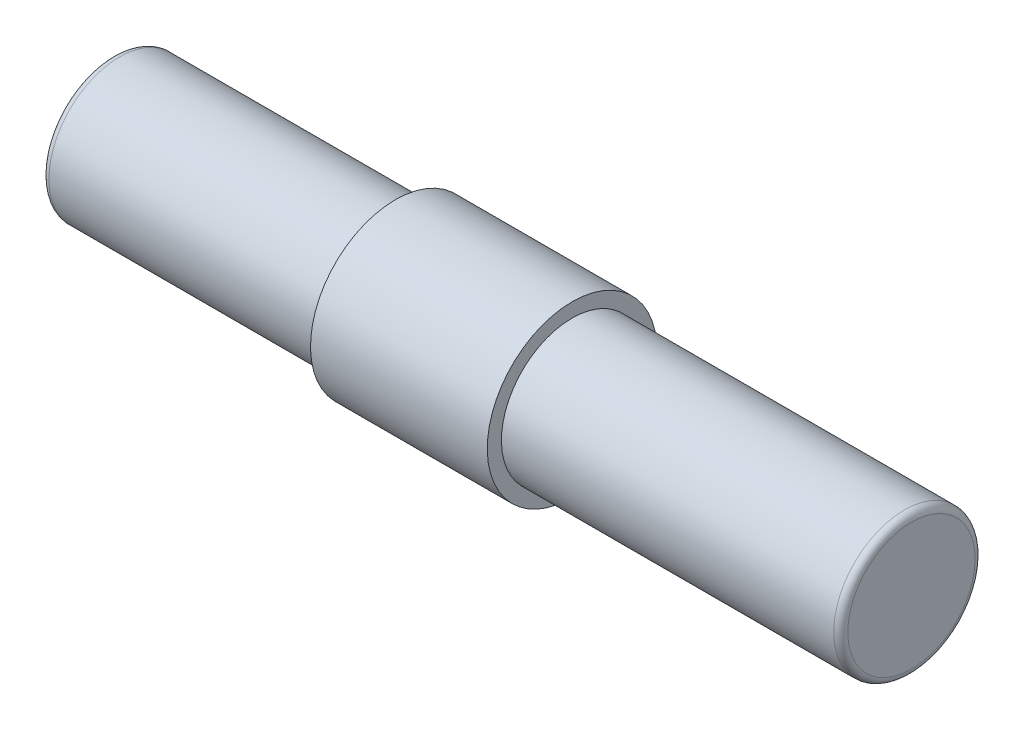
ISO-10303-21;
HEADER;
FILE_DESCRIPTION(('STEP AP214'),'2;1');
FILE_NAME('part.step','',(''),(''),'','','');
FILE_SCHEMA(('AUTOMOTIVE_DESIGN { 1 0 10303 214 1 1 1 1 }'));
ENDSEC;
DATA;
#1=APPLICATION_CONTEXT('core data for automotive mechanical design processes');
#2=APPLICATION_PROTOCOL_DEFINITION('international standard','automotive_design',2000,#1);
#3=PRODUCT_CONTEXT('',#1,'mechanical');
#4=PRODUCT('Part','Part','',(#3));
#5=PRODUCT_RELATED_PRODUCT_CATEGORY('part','',(#4));
#6=PRODUCT_DEFINITION_FORMATION('','',#4);
#7=PRODUCT_DEFINITION_CONTEXT('part definition',#1,'design');
#8=PRODUCT_DEFINITION('design','',#6,#7);
#9=PRODUCT_DEFINITION_SHAPE('','',#8);
#10=(LENGTH_UNIT() NAMED_UNIT(*) SI_UNIT(.MILLI.,.METRE.));
#11=(NAMED_UNIT(*) PLANE_ANGLE_UNIT() SI_UNIT($,.RADIAN.));
#12=(NAMED_UNIT(*) SI_UNIT($,.STERADIAN.) SOLID_ANGLE_UNIT());
#13=UNCERTAINTY_MEASURE_WITH_UNIT(LENGTH_MEASURE(1.E-05),#10,'distance_accuracy_value','');
#14=(GEOMETRIC_REPRESENTATION_CONTEXT(3) GLOBAL_UNCERTAINTY_ASSIGNED_CONTEXT((#13)) GLOBAL_UNIT_ASSIGNED_CONTEXT((#10,
#11,#12)) REPRESENTATION_CONTEXT('',''));
#15=CARTESIAN_POINT('',(0.,0.,0.));
#16=DIRECTION('',(0.,0.,1.));
#17=DIRECTION('',(1.,0.,0.));
#18=AXIS2_PLACEMENT_3D('',#15,#16,#17);
#19=CARTESIAN_POINT('',(-57.4683821152127,0.,0.));
#20=DIRECTION('',(-1.,0.,0.));
#21=DIRECTION('',(0.,-1.,0.));
#22=AXIS2_PLACEMENT_3D('',#19,#20,#21);
#23=PLANE('',#22);
#24=CARTESIAN_POINT('',(-57.4683821152127,0.,0.));
#25=DIRECTION('',(-1.,0.,0.));
#26=DIRECTION('',(0.,-1.,0.));
#27=AXIS2_PLACEMENT_3D('',#24,#25,#26);
#28=CIRCLE('',#27,4.5);
#29=CARTESIAN_POINT('',(-57.4683821152127,-4.5,0.));
#30=VERTEX_POINT('',#29);
#31=EDGE_CURVE('E10',#30,#30,#28,.T.);
#32=ORIENTED_EDGE('',*,*,#31,.T.);
#33=EDGE_LOOP('',(#32));
#34=FACE_BOUND('',#33,.T.);
#35=ADVANCED_FACE('F32',(#34),#23,.T.);
#36=CARTESIAN_POINT('',(-0.968382115212707,0.,0.));
#37=DIRECTION('',(1.,0.,0.));
#38=DIRECTION('',(0.,1.,0.));
#39=AXIS2_PLACEMENT_3D('',#36,#37,#38);
#40=CYLINDRICAL_SURFACE('',#39,5.);
#41=CARTESIAN_POINT('',(-56.9683821152127,0.,0.));
#42=DIRECTION('',(-1.,0.,0.));
#43=DIRECTION('',(0.,-1.,0.));
#44=AXIS2_PLACEMENT_3D('',#41,#42,#43);
#45=CIRCLE('',#44,5.);
#46=CARTESIAN_POINT('',(-56.9683821152127,-5.,0.));
#47=VERTEX_POINT('',#46);
#48=EDGE_CURVE('E39',#47,#47,#45,.F.);
#49=ORIENTED_EDGE('',*,*,#48,.T.);
#50=EDGE_LOOP('',(#49));
#51=FACE_BOUND('',#50,.T.);
#52=CARTESIAN_POINT('',(-37.4683821152127,0.,0.));
#53=DIRECTION('',(1.,0.,0.));
#54=DIRECTION('',(0.,1.,0.));
#55=AXIS2_PLACEMENT_3D('',#52,#53,#54);
#56=CIRCLE('',#55,5.);
#57=CARTESIAN_POINT('',(-37.4683821152127,5.,0.));
#58=VERTEX_POINT('',#57);
#59=EDGE_CURVE('E52',#58,#58,#56,.T.);
#60=ORIENTED_EDGE('',*,*,#59,.F.);
#61=EDGE_LOOP('',(#60));
#62=FACE_BOUND('',#61,.T.);
#63=ADVANCED_FACE('F83',(#51,#62),#40,.T.);
#64=CARTESIAN_POINT('',(-37.4683821152127,5.,0.));
#65=DIRECTION('',(-1.,0.,0.));
#66=DIRECTION('',(0.,-1.,0.));
#67=AXIS2_PLACEMENT_3D('',#64,#65,#66);
#68=PLANE('',#67);
#69=ORIENTED_EDGE('',*,*,#59,.T.);
#70=EDGE_LOOP('',(#69));
#71=FACE_BOUND('',#70,.T.);
#72=CARTESIAN_POINT('',(-37.4683821152127,0.,0.));
#73=DIRECTION('',(1.,0.,0.));
#74=DIRECTION('',(0.,1.,0.));
#75=AXIS2_PLACEMENT_3D('',#72,#73,#74);
#76=CIRCLE('',#75,6.);
#77=CARTESIAN_POINT('',(-37.4683821152127,6.,0.));
#78=VERTEX_POINT('',#77);
#79=EDGE_CURVE('E55',#78,#78,#76,.T.);
#80=ORIENTED_EDGE('',*,*,#79,.F.);
#81=EDGE_LOOP('',(#80));
#82=FACE_BOUND('',#81,.T.);
#83=ADVANCED_FACE('F79',(#71,#82),#68,.T.);
#84=CARTESIAN_POINT('',(-0.968382115212707,0.,0.));
#85=DIRECTION('',(1.,0.,0.));
#86=DIRECTION('',(0.,1.,0.));
#87=AXIS2_PLACEMENT_3D('',#84,#85,#86);
#88=CYLINDRICAL_SURFACE('',#87,6.);
#89=ORIENTED_EDGE('',*,*,#79,.T.);
#90=EDGE_LOOP('',(#89));
#91=FACE_BOUND('',#90,.T.);
#92=CARTESIAN_POINT('',(-24.9683821152127,0.,0.));
#93=DIRECTION('',(1.,0.,0.));
#94=DIRECTION('',(0.,1.,0.));
#95=AXIS2_PLACEMENT_3D('',#92,#93,#94);
#96=CIRCLE('',#95,6.);
#97=CARTESIAN_POINT('',(-24.9683821152127,6.,0.));
#98=VERTEX_POINT('',#97);
#99=EDGE_CURVE('E58',#98,#98,#96,.T.);
#100=ORIENTED_EDGE('',*,*,#99,.F.);
#101=EDGE_LOOP('',(#100));
#102=FACE_BOUND('',#101,.T.);
#103=ADVANCED_FACE('F69',(#91,#102),#88,.T.);
#104=CARTESIAN_POINT('',(-24.9683821152127,6.,0.));
#105=DIRECTION('',(1.,0.,0.));
#106=DIRECTION('',(0.,1.,0.));
#107=AXIS2_PLACEMENT_3D('',#104,#105,#106);
#108=PLANE('',#107);
#109=ORIENTED_EDGE('',*,*,#99,.T.);
#110=EDGE_LOOP('',(#109));
#111=FACE_BOUND('',#110,.T.);
#112=CARTESIAN_POINT('',(-24.9683821152127,0.,0.));
#113=DIRECTION('',(1.,0.,0.));
#114=DIRECTION('',(0.,1.,0.));
#115=AXIS2_PLACEMENT_3D('',#112,#113,#114);
#116=CIRCLE('',#115,5.);
#117=CARTESIAN_POINT('',(-24.9683821152127,5.,0.));
#118=VERTEX_POINT('',#117);
#119=EDGE_CURVE('E61',#118,#118,#116,.T.);
#120=ORIENTED_EDGE('',*,*,#119,.F.);
#121=EDGE_LOOP('',(#120));
#122=FACE_BOUND('',#121,.T.);
#123=ADVANCED_FACE('F67',(#111,#122),#108,.T.);
#124=CARTESIAN_POINT('',(-0.968382115212707,0.,0.));
#125=DIRECTION('',(1.,0.,0.));
#126=DIRECTION('',(0.,1.,0.));
#127=AXIS2_PLACEMENT_3D('',#124,#125,#126);
#128=CYLINDRICAL_SURFACE('',#127,5.);
#129=CARTESIAN_POINT('',(-1.46838211521271,0.,0.));
#130=DIRECTION('',(1.,0.,0.));
#131=DIRECTION('',(0.,1.,0.));
#132=AXIS2_PLACEMENT_3D('',#129,#130,#131);
#133=CIRCLE('',#132,5.);
#134=CARTESIAN_POINT('',(-1.46838211521271,5.00000000000001,0.));
#135=VERTEX_POINT('',#134);
#136=EDGE_CURVE('E43',#135,#135,#133,.F.);
#137=ORIENTED_EDGE('',*,*,#136,.T.);
#138=EDGE_LOOP('',(#137));
#139=FACE_BOUND('',#138,.T.);
#140=ORIENTED_EDGE('',*,*,#119,.T.);
#141=EDGE_LOOP('',(#140));
#142=FACE_BOUND('',#141,.T.);
#143=ADVANCED_FACE('F65',(#139,#142),#128,.T.);
#144=CARTESIAN_POINT('',(-0.968382115212708,5.,0.));
#145=DIRECTION('',(1.,0.,0.));
#146=DIRECTION('',(0.,1.,0.));
#147=AXIS2_PLACEMENT_3D('',#144,#145,#146);
#148=PLANE('',#147);
#149=CARTESIAN_POINT('',(-0.968382115212707,0.,0.));
#150=DIRECTION('',(1.,0.,0.));
#151=DIRECTION('',(0.,1.,0.));
#152=AXIS2_PLACEMENT_3D('',#149,#150,#151);
#153=CIRCLE('',#152,4.5);
#154=CARTESIAN_POINT('',(-0.968382115212707,4.50000000000001,0.));
#155=VERTEX_POINT('',#154);
#156=EDGE_CURVE('E47',#155,#155,#153,.T.);
#157=ORIENTED_EDGE('',*,*,#156,.T.);
#158=EDGE_LOOP('',(#157));
#159=FACE_BOUND('',#158,.T.);
#160=ADVANCED_FACE('F76',(#159),#148,.T.);
#161=CARTESIAN_POINT('',(-1.46838211521271,0.,0.));
#162=DIRECTION('',(1.,0.,0.));
#163=DIRECTION('',(0.,1.,0.));
#164=AXIS2_PLACEMENT_3D('',#161,#162,#163);
#165=TOROIDAL_SURFACE('',#164,4.5,0.5);
#166=ORIENTED_EDGE('',*,*,#136,.F.);
#167=EDGE_LOOP('',(#166));
#168=FACE_BOUND('',#167,.T.);
#169=ORIENTED_EDGE('',*,*,#156,.F.);
#170=EDGE_LOOP('',(#169));
#171=FACE_BOUND('',#170,.T.);
#172=ADVANCED_FACE('F90',(#168,#171),#165,.T.);
#173=CARTESIAN_POINT('',(-56.9683821152127,0.,0.));
#174=DIRECTION('',(-1.,0.,0.));
#175=DIRECTION('',(0.,-1.,0.));
#176=AXIS2_PLACEMENT_3D('',#173,#174,#175);
#177=TOROIDAL_SURFACE('',#176,4.5,0.5);
#178=ORIENTED_EDGE('',*,*,#31,.F.);
#179=EDGE_LOOP('',(#178));
#180=FACE_BOUND('',#179,.T.);
#181=ORIENTED_EDGE('',*,*,#48,.F.);
#182=EDGE_LOOP('',(#181));
#183=FACE_BOUND('',#182,.T.);
#184=ADVANCED_FACE('F34',(#180,#183),#177,.T.);
#185=CLOSED_SHELL('',(#35,#63,#83,#103,#123,#143,#160,#172,#184));
#186=MANIFOLD_SOLID_BREP('B2',#185);
#187=ADVANCED_BREP_SHAPE_REPRESENTATION('',(#18,#186),#14);
#188=SHAPE_DEFINITION_REPRESENTATION(#9,#187);
ENDSEC;
END-ISO-10303-21;
